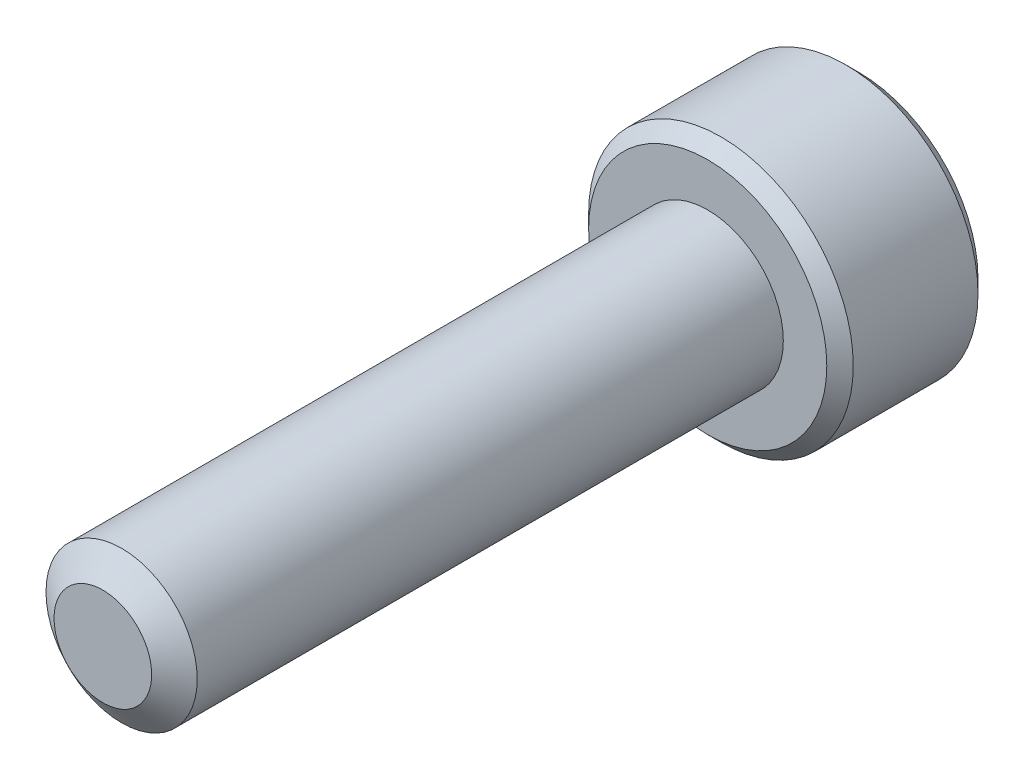
ISO-10303-21;
HEADER;
FILE_DESCRIPTION(('STEP AP214'),'2;1');
FILE_NAME('part.step','',(''),(''),'','','');
FILE_SCHEMA(('AUTOMOTIVE_DESIGN { 1 0 10303 214 1 1 1 1 }'));
ENDSEC;
DATA;
#1=APPLICATION_CONTEXT('core data for automotive mechanical design processes');
#2=APPLICATION_PROTOCOL_DEFINITION('international standard','automotive_design',2000,#1);
#3=PRODUCT_CONTEXT('',#1,'mechanical');
#4=PRODUCT('Part','Part','',(#3));
#5=PRODUCT_RELATED_PRODUCT_CATEGORY('part','',(#4));
#6=PRODUCT_DEFINITION_FORMATION('','',#4);
#7=PRODUCT_DEFINITION_CONTEXT('part definition',#1,'design');
#8=PRODUCT_DEFINITION('design','',#6,#7);
#9=PRODUCT_DEFINITION_SHAPE('','',#8);
#10=(LENGTH_UNIT() NAMED_UNIT(*) SI_UNIT(.MILLI.,.METRE.));
#11=(NAMED_UNIT(*) PLANE_ANGLE_UNIT() SI_UNIT($,.RADIAN.));
#12=(NAMED_UNIT(*) SI_UNIT($,.STERADIAN.) SOLID_ANGLE_UNIT());
#13=UNCERTAINTY_MEASURE_WITH_UNIT(LENGTH_MEASURE(1.E-05),#10,'distance_accuracy_value','');
#14=(GEOMETRIC_REPRESENTATION_CONTEXT(3) GLOBAL_UNCERTAINTY_ASSIGNED_CONTEXT((#13)) GLOBAL_UNIT_ASSIGNED_CONTEXT((#10,
#11,#12)) REPRESENTATION_CONTEXT('',''));
#15=CARTESIAN_POINT('',(0.,0.,0.));
#16=DIRECTION('',(0.,0.,1.));
#17=DIRECTION('',(1.,0.,0.));
#18=AXIS2_PLACEMENT_3D('',#15,#16,#17);
#19=CARTESIAN_POINT('',(-1.5,-0.866025403784439,-17.75));
#20=DIRECTION('',(-1.,0.,0.));
#21=DIRECTION('',(0.,-1.,0.));
#22=AXIS2_PLACEMENT_3D('',#19,#20,#21);
#23=PLANE('',#22);
#24=CARTESIAN_POINT('',(-1.50000000000528,0.866025403801584,-19.999999999995));
#25=CARTESIAN_POINT('',(-1.5000000000019,0.806882875043421,-19.9704563278094));
#26=CARTESIAN_POINT('',(-1.50000000000051,0.746757784428058,-19.9426377148115));
#27=CARTESIAN_POINT('',(-1.49999999999949,0.624133827080468,-19.8916456353052));
#28=CARTESIAN_POINT('',(-1.49999999999986,0.561622210460355,-19.8685031009579));
#29=CARTESIAN_POINT('',(-1.50000000000014,0.434792284451485,-19.8285409180627));
#30=CARTESIAN_POINT('',(-1.50000000000004,0.370480901451347,-19.8116998708606));
#31=CARTESIAN_POINT('',(-1.49999999999996,0.240448320942549,-19.7857723506596));
#32=CARTESIAN_POINT('',(-1.5,0.174732136141869,-19.7766618977947));
#33=CARTESIAN_POINT('',(-1.5,0.0906470714654629,-19.7705759515942));
#34=CARTESIAN_POINT('',(-1.5,0.0725267485204333,-19.7695920445211));
#35=CARTESIAN_POINT('',(-1.5,0.0362717967778035,-19.7682785458525));
#36=CARTESIAN_POINT('',(-1.5,0.0181371811139475,-19.7679485988137));
#37=CARTESIAN_POINT('',(-1.5,-0.0455207597373242,-19.7679506822569));
#38=CARTESIAN_POINT('',(-1.5,-0.0910576795355916,-19.77003428509));
#39=CARTESIAN_POINT('',(-1.5,-0.181776355993392,-19.7782449521126));
#40=CARTESIAN_POINT('',(-1.5,-0.226957842677638,-19.7843748365196));
#41=CARTESIAN_POINT('',(-1.5,-0.361900159540508,-19.8084506931252));
#42=CARTESIAN_POINT('',(-1.5,-0.45067753991022,-19.8320787850761));
#43=CARTESIAN_POINT('',(-1.5,-0.594082384134895,-19.8804157751675));
#44=CARTESIAN_POINT('',(-1.5,-0.649878130235715,-19.9019096020201));
#45=CARTESIAN_POINT('',(-1.5,-0.75935694247947,-19.9484936597313));
#46=CARTESIAN_POINT('',(-1.5,-0.813054664479742,-19.9735491978801));
#47=CARTESIAN_POINT('',(-1.5,-0.866025403800748,-19.9999999999975));
#48=B_SPLINE_CURVE_WITH_KNOTS('',3,(#24,#25,#26,#27,#28,#29,#30,#31,#32,#33,#34,#35,#36,#37,#38,
#39,#40,#41,#42,#43,#44,#45,#46,#47),.UNSPECIFIED.,.F.,.F.,(4,2,2,2,2,2,2,2,2,2,2,4),(0.,
0.198469799187675,0.398212335703268,0.597270292393039,0.795708501538898,0.850141373303903,
0.904544651342541,1.04108618626802,1.17772298989549,1.45212536753346,1.63138869988285,
1.80901239746727),.UNSPECIFIED.);
#49=CARTESIAN_POINT('',(-1.50000000002135,0.866025403796765,-20.000000000014));
#50=VERTEX_POINT('',#49);
#51=CARTESIAN_POINT('',(-1.50000000002135,-0.866025403796765,-20.000000000014));
#52=VERTEX_POINT('',#51);
#53=EDGE_CURVE('E21',#50,#52,#48,.T.);
#54=ORIENTED_EDGE('',*,*,#53,.F.);
#55=DIRECTION('',(0.,0.,1.));
#56=VECTOR('',#55,1.);
#57=CARTESIAN_POINT('',(-1.5,0.866025403784439,-17.75));
#58=LINE('',#57,#56);
#59=CARTESIAN_POINT('',(-1.5,0.866025403784439,-17.75));
#60=VERTEX_POINT('',#59);
#61=EDGE_CURVE('E76',#50,#60,#58,.T.);
#62=ORIENTED_EDGE('',*,*,#61,.T.);
#63=DIRECTION('',(0.,1.,0.));
#64=VECTOR('',#63,1.);
#65=CARTESIAN_POINT('',(-1.5,2.59807621135332,-17.75));
#66=LINE('',#65,#64);
#67=CARTESIAN_POINT('',(-1.5,-0.866025403784439,-17.75));
#68=VERTEX_POINT('',#67);
#69=EDGE_CURVE('E82',#68,#60,#66,.T.);
#70=ORIENTED_EDGE('',*,*,#69,.F.);
#71=DIRECTION('',(0.,0.,1.));
#72=VECTOR('',#71,1.);
#73=CARTESIAN_POINT('',(-1.5,-0.866025403784439,-17.75));
#74=LINE('',#73,#72);
#75=EDGE_CURVE('E79',#68,#52,#74,.F.);
#76=ORIENTED_EDGE('',*,*,#75,.T.);
#77=EDGE_LOOP('',(#54,#62,#70,#76));
#78=FACE_BOUND('',#77,.T.);
#79=ADVANCED_FACE('F17',(#78),#23,.F.);
#80=CARTESIAN_POINT('',(1.5,2.59807621135332,-17.75));
#81=DIRECTION('',(0.,0.,-1.));
#82=DIRECTION('',(-1.,0.,0.));
#83=AXIS2_PLACEMENT_3D('',#80,#81,#82);
#84=PLANE('',#83);
#85=DIRECTION('',(0.866025403784439,-0.5,0.));
#86=VECTOR('',#85,1.);
#87=CARTESIAN_POINT('',(0.,-1.73205080756888,-17.75));
#88=LINE('',#87,#86);
#89=CARTESIAN_POINT('',(0.,-1.73205080756888,-17.75));
#90=VERTEX_POINT('',#89);
#91=EDGE_CURVE('E102',#90,#68,#88,.F.);
#92=ORIENTED_EDGE('',*,*,#91,.T.);
#93=ORIENTED_EDGE('',*,*,#69,.T.);
#94=DIRECTION('',(-0.866025403784439,-0.5,0.));
#95=VECTOR('',#94,1.);
#96=CARTESIAN_POINT('',(-1.5,0.866025403784439,-17.75));
#97=LINE('',#96,#95);
#98=CARTESIAN_POINT('',(0.,1.73205080756888,-17.75));
#99=VERTEX_POINT('',#98);
#100=EDGE_CURVE('E100',#60,#99,#97,.F.);
#101=ORIENTED_EDGE('',*,*,#100,.T.);
#102=DIRECTION('',(-0.866025403784439,0.5,0.));
#103=VECTOR('',#102,1.);
#104=CARTESIAN_POINT('',(0.,1.73205080756888,-17.75));
#105=LINE('',#104,#103);
#106=CARTESIAN_POINT('',(1.5,0.866025403784439,-17.75));
#107=VERTEX_POINT('',#106);
#108=EDGE_CURVE('E259',#99,#107,#105,.F.);
#109=ORIENTED_EDGE('',*,*,#108,.T.);
#110=DIRECTION('',(0.,1.,0.));
#111=VECTOR('',#110,1.);
#112=CARTESIAN_POINT('',(1.5,0.866025403784439,-17.75));
#113=LINE('',#112,#111);
#114=CARTESIAN_POINT('',(1.5,-0.866025403784439,-17.75));
#115=VERTEX_POINT('',#114);
#116=EDGE_CURVE('E265',#107,#115,#113,.F.);
#117=ORIENTED_EDGE('',*,*,#116,.T.);
#118=DIRECTION('',(0.866025403784439,0.5,0.));
#119=VECTOR('',#118,1.);
#120=CARTESIAN_POINT('',(1.5,-0.866025403784439,-17.75));
#121=LINE('',#120,#119);
#122=EDGE_CURVE('E271',#115,#90,#121,.F.);
#123=ORIENTED_EDGE('',*,*,#122,.T.);
#124=EDGE_LOOP('',(#92,#93,#101,#109,#117,#123));
#125=FACE_BOUND('',#124,.T.);
#126=ADVANCED_FACE('F188',(#125),#84,.T.);
#127=CARTESIAN_POINT('',(-1.5,0.866025403784439,-17.75));
#128=DIRECTION('',(-0.5,0.866025403784439,0.));
#129=DIRECTION('',(-0.866025403784439,-0.5,0.));
#130=AXIS2_PLACEMENT_3D('',#127,#128,#129);
#131=PLANE('',#130);
#132=CARTESIAN_POINT('',(-1.50000000001384,0.866025403776446,-19.9999999999973));
#133=CARTESIAN_POINT('',(-1.44844426727188,0.895791119953286,-19.9702628495471));
#134=CARTESIAN_POINT('',(-1.39602652188553,0.926054519362411,-19.9422725002981));
#135=CARTESIAN_POINT('',(-1.28914135981358,0.98776469645703,-19.891023365733));
#136=CARTESIAN_POINT('',(-1.23466378389773,1.01921733957684,-19.8677930861008));
#137=CARTESIAN_POINT('',(-1.12481242370922,1.08264005195252,-19.827999460956));
#138=CARTESIAN_POINT('',(-1.0694666001953,1.11459397805681,-19.8113361226596));
#139=CARTESIAN_POINT('',(-0.957556855434341,1.17920509931949,-19.7856630756138));
#140=CARTESIAN_POINT('',(-0.900996350406153,1.21186032212301,-19.7766342100916));
#141=CARTESIAN_POINT('',(-0.803509072979876,1.26814462798764,-19.7684874106486));
#142=CARTESIAN_POINT('',(-0.762708138291304,1.29170105861327,-19.7672818824402));
#143=CARTESIAN_POINT('',(-0.681178340922777,1.33877230907097,-19.7693161381529));
#144=CARTESIAN_POINT('',(-0.640449496153036,1.36228711856256,-19.7725569040307));
#145=CARTESIAN_POINT('',(-0.55938406541502,1.40909026682113,-19.7832973052436));
#146=CARTESIAN_POINT('',(-0.519047879729584,1.4323783744847,-19.7908009008483));
#147=CARTESIAN_POINT('',(-0.439052551507189,1.47856369876781,-19.8096594735364));
#148=CARTESIAN_POINT('',(-0.399393707169557,1.50146074322189,-19.8210161032335));
#149=CARTESIAN_POINT('',(-0.297850129885444,1.56008695490135,-19.8547185813341));
#150=CARTESIAN_POINT('',(-0.236594120363346,1.59545312848842,-19.8796009834656));
#151=CARTESIAN_POINT('',(-0.146523889004659,1.64745520080933,-19.9216037301785));
#152=CARTESIAN_POINT('',(-0.116842951539739,1.6645914980445,-19.9363606542598));
#153=CARTESIAN_POINT('',(-0.0580266310704294,1.6985491165002,-19.9672215279235));
#154=CARTESIAN_POINT('',(-0.028890996465001,1.71537058298265,-19.9833248365504));
#155=CARTESIAN_POINT('',(1.72314668545733E-11,1.73205080757883,-19.9999999999993));
#156=B_SPLINE_CURVE_WITH_KNOTS('',3,(#132,#133,#134,#135,#136,#137,#138,#139,#140,#141,#142,
#143,#144,#145,#146,#147,#148,#149,#150,#151,#152,#153,#154,#155),.UNSPECIFIED.,.F.,.F.,(4,2,2,
2,2,2,2,2,2,2,2,4),(0.,0.19977441987482,0.400712312207091,0.598459990233483,0.795709985569241,
0.936894690687762,1.07811058123955,1.21945787974225,1.36086588064742,1.58533909972686,
1.69726364724869,1.8091352124411),.UNSPECIFIED.);
#157=CARTESIAN_POINT('',(-3.40810312694829E-11,1.7320508075985,-20.000000000019));
#158=VERTEX_POINT('',#157);
#159=EDGE_CURVE('E97',#50,#158,#156,.T.);
#160=ORIENTED_EDGE('',*,*,#159,.T.);
#161=DIRECTION('',(0.,0.,1.));
#162=VECTOR('',#161,1.);
#163=CARTESIAN_POINT('',(0.,1.73205080756888,-17.75));
#164=LINE('',#163,#162);
#165=EDGE_CURVE('E110',#158,#99,#164,.T.);
#166=ORIENTED_EDGE('',*,*,#165,.T.);
#167=ORIENTED_EDGE('',*,*,#100,.F.);
#168=ORIENTED_EDGE('',*,*,#61,.F.);
#169=EDGE_LOOP('',(#160,#166,#167,#168));
#170=FACE_BOUND('',#169,.T.);
#171=ADVANCED_FACE('F95',(#170),#131,.F.);
#172=CARTESIAN_POINT('',(0.,-1.73205080756888,-17.75));
#173=DIRECTION('',(-0.5,-0.866025403784439,0.));
#174=DIRECTION('',(0.866025403784439,-0.5,0.));
#175=AXIS2_PLACEMENT_3D('',#172,#173,#174);
#176=PLANE('',#175);
#177=CARTESIAN_POINT('',(1.72312254060688E-11,-1.73205080757883,-19.9999999999993));
#178=CARTESIAN_POINT('',(-0.0515557327249302,-1.70228509140187,-19.9702628495488));
#179=CARTESIAN_POINT('',(-0.103973478111488,-1.67202169199263,-19.9422725002996));
#180=CARTESIAN_POINT('',(-0.210858640183868,-1.61031151489776,-19.8910233657342));
#181=CARTESIAN_POINT('',(-0.26533621609994,-1.57885887177782,-19.8677930861018));
#182=CARTESIAN_POINT('',(-0.375187576288911,-1.51543615940187,-19.8279994609566));
#183=CARTESIAN_POINT('',(-0.430533399803071,-1.48348223329745,-19.81133612266));
#184=CARTESIAN_POINT('',(-0.542443144564532,-1.41887111203448,-19.785663075614));
#185=CARTESIAN_POINT('',(-0.599003649592977,-1.3862158892308,-19.7766342100917));
#186=CARTESIAN_POINT('',(-0.696490927019526,-1.32993158336602,-19.7684874106486));
#187=CARTESIAN_POINT('',(-0.73729186170811,-1.30637515274038,-19.7672818824402));
#188=CARTESIAN_POINT('',(-0.818821659076663,-1.25930390228267,-19.7693161381528));
#189=CARTESIAN_POINT('',(-0.859550503846418,-1.23578909279107,-19.7725569040307));
#190=CARTESIAN_POINT('',(-0.940615934584459,-1.18898594453249,-19.7832973052435));
#191=CARTESIAN_POINT('',(-0.980952120269905,-1.16569783686891,-19.7908009008482));
#192=CARTESIAN_POINT('',(-1.06094744849232,-1.11951251258579,-19.8096594735362));
#193=CARTESIAN_POINT('',(-1.10060629282997,-1.0966154681317,-19.8210161032333));
#194=CARTESIAN_POINT('',(-1.20214987011356,-1.03798925645254,-19.8547185813338));
#195=CARTESIAN_POINT('',(-1.26340587963515,-1.00262308286577,-19.879600983465));
#196=CARTESIAN_POINT('',(-1.35347611099311,-0.950621010545279,-19.9216037301774));
#197=CARTESIAN_POINT('',(-1.38315704845779,-0.933484713310244,-19.9363606542586));
#198=CARTESIAN_POINT('',(-1.44197336892664,-0.899527094854813,-19.967221527922));
#199=CARTESIAN_POINT('',(-1.47110900353184,-0.88270562837249,-19.9833248365487));
#200=CARTESIAN_POINT('',(-1.50000000001385,-0.866025403776446,-19.9999999999973));
#201=B_SPLINE_CURVE_WITH_KNOTS('',3,(#177,#178,#179,#180,#181,#182,#183,#184,#185,#186,#187,
#188,#189,#190,#191,#192,#193,#194,#195,#196,#197,#198,#199,#200),.UNSPECIFIED.,.F.,.F.,(4,2,2,
2,2,2,2,2,2,2,2,4),(0.,0.199774419875724,0.400712312208921,0.598459990236235,0.795709985572903,
0.936894690691468,1.0781105812433,1.21945787974603,1.36086588065123,1.58533909972875,
1.69726364724963,1.80913521244109),.UNSPECIFIED.);
#202=CARTESIAN_POINT('',(0.,-1.73205080759353,-20.000000000014));
#203=VERTEX_POINT('',#202);
#204=EDGE_CURVE('E109',#203,#52,#201,.T.);
#205=ORIENTED_EDGE('',*,*,#204,.T.);
#206=ORIENTED_EDGE('',*,*,#75,.F.);
#207=ORIENTED_EDGE('',*,*,#91,.F.);
#208=DIRECTION('',(0.,0.,1.));
#209=VECTOR('',#208,1.);
#210=CARTESIAN_POINT('',(0.,-1.73205080756888,-17.75));
#211=LINE('',#210,#209);
#212=EDGE_CURVE('E268',#90,#203,#211,.F.);
#213=ORIENTED_EDGE('',*,*,#212,.T.);
#214=EDGE_LOOP('',(#205,#206,#207,#213));
#215=FACE_BOUND('',#214,.T.);
#216=ADVANCED_FACE('F179',(#215),#176,.F.);
#217=CARTESIAN_POINT('',(1.5,-0.866025403784439,-17.75));
#218=DIRECTION('',(0.5,-0.866025403784439,0.));
#219=DIRECTION('',(0.866025403784439,0.5,0.));
#220=AXIS2_PLACEMENT_3D('',#217,#218,#219);
#221=PLANE('',#220);
#222=CARTESIAN_POINT('',(1.50000000001723,-0.86602540377449,-19.9999999999993));
#223=CARTESIAN_POINT('',(1.44844426727507,-0.895791119951447,-19.9702628495488));
#224=CARTESIAN_POINT('',(1.39602652188851,-0.926054519360691,-19.9422725002996));
#225=CARTESIAN_POINT('',(1.28914135981612,-0.98776469645556,-19.8910233657341));
#226=CARTESIAN_POINT('',(1.23466378390004,-1.0192173395755,-19.8677930861018));
#227=CARTESIAN_POINT('',(1.12481242371107,-1.08264005195145,-19.8279994609566));
#228=CARTESIAN_POINT('',(1.06946660019692,-1.11459397805587,-19.81133612266));
#229=CARTESIAN_POINT('',(0.957556855435461,-1.17920509931884,-19.785663075614));
#230=CARTESIAN_POINT('',(0.90099635040702,-1.21186032212251,-19.7766342100917));
#231=CARTESIAN_POINT('',(0.803509072980475,-1.26814462798729,-19.7684874106486));
#232=CARTESIAN_POINT('',(0.762708138291893,-1.29170105861293,-19.7672818824402));
#233=CARTESIAN_POINT('',(0.681178340923342,-1.33877230907064,-19.7693161381528));
#234=CARTESIAN_POINT('',(0.640449496153588,-1.36228711856224,-19.7725569040307));
#235=CARTESIAN_POINT('',(0.559384065415547,-1.40909026682082,-19.7832973052435));
#236=CARTESIAN_POINT('',(0.519047879730099,-1.4323783744844,-19.7908009008482));
#237=CARTESIAN_POINT('',(0.439052551507678,-1.47856369876753,-19.8096594735362));
#238=CARTESIAN_POINT('',(0.399393707170034,-1.50146074322162,-19.8210161032333));
#239=CARTESIAN_POINT('',(0.297850129885826,-1.56008695490113,-19.854718581334));
#240=CARTESIAN_POINT('',(0.236594120363648,-1.59545312848824,-19.8796009834655));
#241=CARTESIAN_POINT('',(0.146523889004846,-1.64745520080922,-19.9216037301784));
#242=CARTESIAN_POINT('',(0.116842951539888,-1.66459149804441,-19.9363606542597));
#243=CARTESIAN_POINT('',(0.0580266310705035,-1.69854911650015,-19.9672215279235));
#244=CARTESIAN_POINT('',(0.0288909964650379,-1.71537058298263,-19.9833248365504));
#245=CARTESIAN_POINT('',(-1.72314939480501E-11,-1.73205080757883,-19.9999999999993));
#246=B_SPLINE_CURVE_WITH_KNOTS('',3,(#222,#223,#224,#225,#226,#227,#228,#229,#230,#231,#232,
#233,#234,#235,#236,#237,#238,#239,#240,#241,#242,#243,#244,#245),.UNSPECIFIED.,.F.,.F.,(4,2,2,
2,2,2,2,2,2,2,2,4),(0.,0.199774419875735,0.400712312208944,0.598459990236248,0.795709985572904,
0.936894690691465,1.07811058124329,1.21945787974602,1.36086588065123,1.58533909973094,
1.69726364725292,1.80913521244546),.UNSPECIFIED.);
#247=CARTESIAN_POINT('',(1.50000000002135,-0.866025403796764,-20.000000000014));
#248=VERTEX_POINT('',#247);
#249=EDGE_CURVE('E161',#248,#203,#246,.T.);
#250=ORIENTED_EDGE('',*,*,#249,.T.);
#251=ORIENTED_EDGE('',*,*,#212,.F.);
#252=ORIENTED_EDGE('',*,*,#122,.F.);
#253=DIRECTION('',(0.,0.,-1.));
#254=VECTOR('',#253,1.);
#255=CARTESIAN_POINT('',(1.5,-0.866025403784439,-17.75));
#256=LINE('',#255,#254);
#257=EDGE_CURVE('E262',#115,#248,#256,.T.);
#258=ORIENTED_EDGE('',*,*,#257,.T.);
#259=EDGE_LOOP('',(#250,#251,#252,#258));
#260=FACE_BOUND('',#259,.T.);
#261=ADVANCED_FACE('F175',(#260),#221,.F.);
#262=CARTESIAN_POINT('',(1.5,0.866025403784439,-17.75));
#263=DIRECTION('',(1.,0.,0.));
#264=DIRECTION('',(0.,0.,-1.));
#265=AXIS2_PLACEMENT_3D('',#262,#263,#264);
#266=PLANE('',#265);
#267=CARTESIAN_POINT('',(1.5,0.866025403804336,-19.9999999999993));
#268=CARTESIAN_POINT('',(1.5,0.806493971450421,-19.9702628495488));
#269=CARTESIAN_POINT('',(1.5,0.745967172631933,-19.9422725002996));
#270=CARTESIAN_POINT('',(1.5,0.622546818442195,-19.8910233657341));
#271=CARTESIAN_POINT('',(1.5,0.559641532202306,-19.8677930861018));
#272=CARTESIAN_POINT('',(1.5,0.432796107450408,-19.8279994609566));
#273=CARTESIAN_POINT('',(1.5,0.368888255241567,-19.81133612266));
#274=CARTESIAN_POINT('',(1.5,0.239666012715631,-19.785663075614));
#275=CARTESIAN_POINT('',(1.5,0.174355567108288,-19.7766342100917));
#276=CARTESIAN_POINT('',(1.5,0.0617869553787295,-19.7684874106486));
#277=CARTESIAN_POINT('',(1.5,0.0146740941274464,-19.7672818824402));
#278=CARTESIAN_POINT('',(1.5,-0.0794684067879708,-19.7693161381528));
#279=CARTESIAN_POINT('',(1.5,-0.12649802577117,-19.7725569040307));
#280=CARTESIAN_POINT('',(1.5,-0.220104322288332,-19.7832973052435));
#281=CARTESIAN_POINT('',(1.5,-0.266680537615484,-19.7908009008482));
#282=CARTESIAN_POINT('',(1.5,-0.359051186181738,-19.8096594735362));
#283=CARTESIAN_POINT('',(1.5,-0.404845275089915,-19.8210161032333));
#284=CARTESIAN_POINT('',(1.5,-0.522097698448944,-19.854718581334));
#285=CARTESIAN_POINT('',(1.5,-0.592830045623168,-19.8796009834655));
#286=CARTESIAN_POINT('',(1.5,-0.696834190265121,-19.9216037301784));
#287=CARTESIAN_POINT('',(1.5,-0.73110678473551,-19.9363606542597));
#288=CARTESIAN_POINT('',(1.5,-0.799022021646996,-19.9672215279235));
#289=CARTESIAN_POINT('',(1.5,-0.832664954611947,-19.9833248365504));
#290=CARTESIAN_POINT('',(1.5,-0.866025403804335,-19.9999999999993));
#291=B_SPLINE_CURVE_WITH_KNOTS('',3,(#267,#268,#269,#270,#271,#272,#273,#274,#275,#276,#277,
#278,#279,#280,#281,#282,#283,#284,#285,#286,#287,#288,#289,#290),.UNSPECIFIED.,.F.,.F.,(4,2,2,
2,2,2,2,2,2,2,2,4),(0.,0.199774419875736,0.400712312208945,0.598459990236247,0.795709985572903,
0.936894690691464,1.07811058124329,1.21945787974602,1.36086588065123,1.58533909973094,
1.69726364725292,1.80913521244546),.UNSPECIFIED.);
#292=CARTESIAN_POINT('',(1.50000000002135,0.866025403796765,-20.000000000014));
#293=VERTEX_POINT('',#292);
#294=EDGE_CURVE('E123',#293,#248,#291,.T.);
#295=ORIENTED_EDGE('',*,*,#294,.T.);
#296=ORIENTED_EDGE('',*,*,#257,.F.);
#297=ORIENTED_EDGE('',*,*,#116,.F.);
#298=DIRECTION('',(0.,0.,1.));
#299=VECTOR('',#298,1.);
#300=CARTESIAN_POINT('',(1.5,0.866025403784439,-17.75));
#301=LINE('',#300,#299);
#302=EDGE_CURVE('E46',#107,#293,#301,.F.);
#303=ORIENTED_EDGE('',*,*,#302,.T.);
#304=EDGE_LOOP('',(#295,#296,#297,#303));
#305=FACE_BOUND('',#304,.T.);
#306=ADVANCED_FACE('F178',(#305),#266,.F.);
#307=CARTESIAN_POINT('',(0.,1.73205080756888,-17.75));
#308=DIRECTION('',(0.5,0.866025403784439,0.));
#309=DIRECTION('',(-0.866025403784439,0.5,0.));
#310=AXIS2_PLACEMENT_3D('',#307,#308,#309);
#311=PLANE('',#310);
#312=CARTESIAN_POINT('',(-1.72305140332419E-11,1.73205080757883,-19.9999999999993));
#313=CARTESIAN_POINT('',(0.0515557327249341,1.70228509140187,-19.9702628495488));
#314=CARTESIAN_POINT('',(0.103973478111494,1.67202169199262,-19.9422725002996));
#315=CARTESIAN_POINT('',(0.21085864018388,1.61031151489776,-19.8910233657341));
#316=CARTESIAN_POINT('',(0.265336216099955,1.57885887177781,-19.8677930861018));
#317=CARTESIAN_POINT('',(0.375187576288925,1.51543615940186,-19.8279994609566));
#318=CARTESIAN_POINT('',(0.430533399803083,1.48348223329744,-19.81133612266));
#319=CARTESIAN_POINT('',(0.542443144564537,1.41887111203448,-19.785663075614));
#320=CARTESIAN_POINT('',(0.599003649592977,1.3862158892308,-19.7766342100917));
#321=CARTESIAN_POINT('',(0.696490927019521,1.32993158336603,-19.7684874106486));
#322=CARTESIAN_POINT('',(0.737291861708103,1.30637515274038,-19.7672818824402));
#323=CARTESIAN_POINT('',(0.818821659076654,1.25930390228268,-19.7693161381528));
#324=CARTESIAN_POINT('',(0.859550503846408,1.23578909279108,-19.7725569040307));
#325=CARTESIAN_POINT('',(0.940615934584449,1.18898594453249,-19.7832973052435));
#326=CARTESIAN_POINT('',(0.980952120269897,1.16569783686892,-19.7908009008482));
#327=CARTESIAN_POINT('',(1.06094744849232,1.11951251258579,-19.8096594735362));
#328=CARTESIAN_POINT('',(1.10060629282996,1.0966154681317,-19.8210161032333));
#329=CARTESIAN_POINT('',(1.20214987011417,1.03798925645219,-19.854718581334));
#330=CARTESIAN_POINT('',(1.26340587963635,1.00262308286508,-19.8796009834655));
#331=CARTESIAN_POINT('',(1.35347611099515,0.9506210105441,-19.9216037301784));
#332=CARTESIAN_POINT('',(1.38315704846011,0.933484713308906,-19.9363606542597));
#333=CARTESIAN_POINT('',(1.4419733689295,0.899527094853162,-19.9672215279235));
#334=CARTESIAN_POINT('',(1.47110900353496,0.882705628370685,-19.9833248365504));
#335=CARTESIAN_POINT('',(1.50000000001723,0.866025403774491,-19.9999999999993));
#336=B_SPLINE_CURVE_WITH_KNOTS('',3,(#312,#313,#314,#315,#316,#317,#318,#319,#320,#321,#322,
#323,#324,#325,#326,#327,#328,#329,#330,#331,#332,#333,#334,#335),.UNSPECIFIED.,.F.,.F.,(4,2,2,
2,2,2,2,2,2,2,2,4),(0.,0.199774419875735,0.400712312208942,0.598459990236243,0.795709985572898,
0.936894690691458,1.07811058124329,1.21945787974602,1.36086588065123,1.58533909973093,
1.69726364725291,1.80913521244546),.UNSPECIFIED.);
#337=EDGE_CURVE('E118',#158,#293,#336,.T.);
#338=ORIENTED_EDGE('',*,*,#337,.T.);
#339=ORIENTED_EDGE('',*,*,#302,.F.);
#340=ORIENTED_EDGE('',*,*,#108,.F.);
#341=ORIENTED_EDGE('',*,*,#165,.F.);
#342=EDGE_LOOP('',(#338,#339,#340,#341));
#343=FACE_BOUND('',#342,.T.);
#344=ADVANCED_FACE('F140',(#343),#311,.F.);
#345=CARTESIAN_POINT('',(0.,0.,-20.0000000000387));
#346=DIRECTION('',(0.,0.,-1.));
#347=DIRECTION('',(-1.,0.,0.));
#348=AXIS2_PLACEMENT_3D('',#345,#346,#347);
#349=CONICAL_SURFACE('',#348,1.73205080761818,0.785398163397448);
#350=ORIENTED_EDGE('',*,*,#159,.F.);
#351=CARTESIAN_POINT('',(0.,0.,-20.0000000000387));
#352=DIRECTION('',(0.,0.,-1.));
#353=DIRECTION('',(-1.,0.,0.));
#354=AXIS2_PLACEMENT_3D('',#351,#352,#353);
#355=CIRCLE('',#354,1.73205080761818);
#356=EDGE_CURVE('E91',#158,#50,#355,.F.);
#357=ORIENTED_EDGE('',*,*,#356,.F.);
#358=EDGE_LOOP('',(#350,#357));
#359=FACE_BOUND('',#358,.T.);
#360=ADVANCED_FACE('F106',(#359),#349,.F.);
#361=CARTESIAN_POINT('',(0.,0.,-20.0000000000387));
#362=DIRECTION('',(0.,0.,-1.));
#363=DIRECTION('',(-1.,0.,0.));
#364=AXIS2_PLACEMENT_3D('',#361,#362,#363);
#365=CONICAL_SURFACE('',#364,1.73205080761818,0.785398163397448);
#366=ORIENTED_EDGE('',*,*,#53,.T.);
#367=CARTESIAN_POINT('',(0.,0.,-20.0000000000387));
#368=DIRECTION('',(0.,0.,-1.));
#369=DIRECTION('',(-1.,0.,0.));
#370=AXIS2_PLACEMENT_3D('',#367,#368,#369);
#371=CIRCLE('',#370,1.73205080761818);
#372=EDGE_CURVE('E84',#50,#52,#371,.F.);
#373=ORIENTED_EDGE('',*,*,#372,.F.);
#374=EDGE_LOOP('',(#366,#373));
#375=FACE_BOUND('',#374,.T.);
#376=ADVANCED_FACE('F85',(#375),#365,.F.);
#377=CARTESIAN_POINT('',(0.,0.,-20.0000000000387));
#378=DIRECTION('',(0.,0.,-1.));
#379=DIRECTION('',(-1.,0.,0.));
#380=AXIS2_PLACEMENT_3D('',#377,#378,#379);
#381=CONICAL_SURFACE('',#380,1.73205080761818,0.785398163397448);
#382=ORIENTED_EDGE('',*,*,#204,.F.);
#383=CARTESIAN_POINT('',(0.,0.,-20.0000000000387));
#384=DIRECTION('',(0.,0.,-1.));
#385=DIRECTION('',(-1.,0.,0.));
#386=AXIS2_PLACEMENT_3D('',#383,#384,#385);
#387=CIRCLE('',#386,1.73205080761818);
#388=EDGE_CURVE('E90',#52,#203,#387,.F.);
#389=ORIENTED_EDGE('',*,*,#388,.F.);
#390=EDGE_LOOP('',(#382,#389));
#391=FACE_BOUND('',#390,.T.);
#392=ADVANCED_FACE('F158',(#391),#381,.F.);
#393=CARTESIAN_POINT('',(0.,0.,-20.0000000000387));
#394=DIRECTION('',(0.,0.,-1.));
#395=DIRECTION('',(-1.,0.,0.));
#396=AXIS2_PLACEMENT_3D('',#393,#394,#395);
#397=CONICAL_SURFACE('',#396,1.73205080761818,0.785398163397448);
#398=ORIENTED_EDGE('',*,*,#249,.F.);
#399=CARTESIAN_POINT('',(0.,0.,-20.0000000000387));
#400=DIRECTION('',(0.,0.,-1.));
#401=DIRECTION('',(-1.,0.,0.));
#402=AXIS2_PLACEMENT_3D('',#399,#400,#401);
#403=CIRCLE('',#402,1.73205080761818);
#404=EDGE_CURVE('E322',#203,#248,#403,.F.);
#405=ORIENTED_EDGE('',*,*,#404,.F.);
#406=EDGE_LOOP('',(#398,#405));
#407=FACE_BOUND('',#406,.T.);
#408=ADVANCED_FACE('F153',(#407),#397,.F.);
#409=CARTESIAN_POINT('',(0.,0.,-20.0000000000387));
#410=DIRECTION('',(0.,0.,-1.));
#411=DIRECTION('',(-1.,0.,0.));
#412=AXIS2_PLACEMENT_3D('',#409,#410,#411);
#413=CONICAL_SURFACE('',#412,1.73205080761818,0.785398163397448);
#414=ORIENTED_EDGE('',*,*,#294,.F.);
#415=CARTESIAN_POINT('',(0.,0.,-20.0000000000387));
#416=DIRECTION('',(0.,0.,-1.));
#417=DIRECTION('',(-1.,0.,0.));
#418=AXIS2_PLACEMENT_3D('',#415,#416,#417);
#419=CIRCLE('',#418,1.73205080761818);
#420=EDGE_CURVE('E319',#248,#293,#419,.F.);
#421=ORIENTED_EDGE('',*,*,#420,.F.);
#422=EDGE_LOOP('',(#414,#421));
#423=FACE_BOUND('',#422,.T.);
#424=ADVANCED_FACE('F147',(#423),#413,.F.);
#425=CARTESIAN_POINT('',(0.,0.,-20.0000000000387));
#426=DIRECTION('',(0.,0.,-1.));
#427=DIRECTION('',(-1.,0.,0.));
#428=AXIS2_PLACEMENT_3D('',#425,#426,#427);
#429=CONICAL_SURFACE('',#428,1.73205080761818,0.785398163397448);
#430=ORIENTED_EDGE('',*,*,#337,.F.);
#431=CARTESIAN_POINT('',(0.,0.,-20.0000000000387));
#432=DIRECTION('',(0.,0.,-1.));
#433=DIRECTION('',(-1.,0.,0.));
#434=AXIS2_PLACEMENT_3D('',#431,#432,#433);
#435=CIRCLE('',#434,1.73205080761818);
#436=EDGE_CURVE('E116',#293,#158,#435,.F.);
#437=ORIENTED_EDGE('',*,*,#436,.F.);
#438=EDGE_LOOP('',(#430,#437));
#439=FACE_BOUND('',#438,.T.);
#440=ADVANCED_FACE('F143',(#439),#429,.F.);
#441=CARTESIAN_POINT('',(0.,0.,-20.));
#442=DIRECTION('',(0.,0.,-1.));
#443=DIRECTION('',(-1.,0.,0.));
#444=AXIS2_PLACEMENT_3D('',#441,#442,#443);
#445=PLANE('',#444);
#446=ORIENTED_EDGE('',*,*,#420,.T.);
#447=ORIENTED_EDGE('',*,*,#436,.T.);
#448=ORIENTED_EDGE('',*,*,#356,.T.);
#449=ORIENTED_EDGE('',*,*,#372,.T.);
#450=ORIENTED_EDGE('',*,*,#388,.T.);
#451=ORIENTED_EDGE('',*,*,#404,.T.);
#452=EDGE_LOOP('',(#446,#447,#448,#449,#450,#451));
#453=FACE_BOUND('',#452,.T.);
#454=CARTESIAN_POINT('',(0.,0.,-19.9999999999818));
#455=DIRECTION('',(0.,0.,1.));
#456=DIRECTION('',(1.,0.,0.));
#457=AXIS2_PLACEMENT_3D('',#454,#455,#456);
#458=CIRCLE('',#457,3.15000000000509);
#459=CARTESIAN_POINT('',(3.15000000000509,0.,-19.9999999999818));
#460=VERTEX_POINT('',#459);
#461=EDGE_CURVE('E238',#460,#460,#458,.T.);
#462=ORIENTED_EDGE('',*,*,#461,.F.);
#463=EDGE_LOOP('',(#462));
#464=FACE_BOUND('',#463,.T.);
#465=ADVANCED_FACE('F113',(#453,#464),#445,.T.);
#466=CARTESIAN_POINT('',(0.,0.,-19.6500000000128));
#467=DIRECTION('',(0.,0.,1.));
#468=DIRECTION('',(1.,0.,0.));
#469=AXIS2_PLACEMENT_3D('',#466,#467,#468);
#470=CONICAL_SURFACE('',#469,3.50000000003092,0.785398163478653);
#471=ORIENTED_EDGE('',*,*,#461,.T.);
#472=EDGE_LOOP('',(#471));
#473=FACE_BOUND('',#472,.T.);
#474=CARTESIAN_POINT('',(0.,0.,-19.65));
#475=DIRECTION('',(0.,0.,1.));
#476=DIRECTION('',(1.,0.,0.));
#477=AXIS2_PLACEMENT_3D('',#474,#475,#476);
#478=CIRCLE('',#477,3.5);
#479=CARTESIAN_POINT('',(3.5,0.,-19.65));
#480=VERTEX_POINT('',#479);
#481=EDGE_CURVE('E241',#480,#480,#478,.T.);
#482=ORIENTED_EDGE('',*,*,#481,.F.);
#483=EDGE_LOOP('',(#482));
#484=FACE_BOUND('',#483,.T.);
#485=ADVANCED_FACE('F228',(#473,#484),#470,.T.);
#486=CARTESIAN_POINT('',(0.,0.,-20.));
#487=DIRECTION('',(0.,0.,1.));
#488=DIRECTION('',(1.,0.,0.));
#489=AXIS2_PLACEMENT_3D('',#486,#487,#488);
#490=CYLINDRICAL_SURFACE('',#489,3.5);
#491=ORIENTED_EDGE('',*,*,#481,.T.);
#492=EDGE_LOOP('',(#491));
#493=FACE_BOUND('',#492,.T.);
#494=CARTESIAN_POINT('',(0.,0.,-16.3499999999885));
#495=DIRECTION('',(0.,0.,-1.));
#496=DIRECTION('',(-1.,0.,0.));
#497=AXIS2_PLACEMENT_3D('',#494,#495,#496);
#498=CIRCLE('',#497,3.50000000003092);
#499=CARTESIAN_POINT('',(-3.50000000003092,0.,-16.3499999999885));
#500=VERTEX_POINT('',#499);
#501=EDGE_CURVE('E243',#500,#500,#498,.F.);
#502=ORIENTED_EDGE('',*,*,#501,.F.);
#503=EDGE_LOOP('',(#502));
#504=FACE_BOUND('',#503,.T.);
#505=ADVANCED_FACE('F225',(#493,#504),#490,.T.);
#506=CARTESIAN_POINT('',(0.,0.,-16.3499999999885));
#507=DIRECTION('',(0.,0.,-1.));
#508=DIRECTION('',(-1.,0.,0.));
#509=AXIS2_PLACEMENT_3D('',#506,#507,#508);
#510=CONICAL_SURFACE('',#509,3.50000000003092,0.785398163478653);
#511=CARTESIAN_POINT('',(0.,0.,-16.0000000000196));
#512=DIRECTION('',(0.,0.,-1.));
#513=DIRECTION('',(-1.,0.,0.));
#514=AXIS2_PLACEMENT_3D('',#511,#512,#513);
#515=CIRCLE('',#514,3.15000000000509);
#516=CARTESIAN_POINT('',(-3.15000000000509,0.,-16.0000000000196));
#517=VERTEX_POINT('',#516);
#518=EDGE_CURVE('E249',#517,#517,#515,.T.);
#519=ORIENTED_EDGE('',*,*,#518,.T.);
#520=EDGE_LOOP('',(#519));
#521=FACE_BOUND('',#520,.T.);
#522=ORIENTED_EDGE('',*,*,#501,.T.);
#523=EDGE_LOOP('',(#522));
#524=FACE_BOUND('',#523,.T.);
#525=ADVANCED_FACE('F221',(#521,#524),#510,.T.);
#526=CARTESIAN_POINT('',(0.,0.,0.));
#527=DIRECTION('',(0.,0.,1.));
#528=DIRECTION('',(1.,0.,0.));
#529=AXIS2_PLACEMENT_3D('',#526,#527,#528);
#530=PLANE('',#529);
#531=CARTESIAN_POINT('',(0.,0.,1.70412729066927E-11));
#532=DIRECTION('',(0.,0.,-1.));
#533=DIRECTION('',(-1.,0.,0.));
#534=AXIS2_PLACEMENT_3D('',#531,#532,#533);
#535=CIRCLE('',#534,1.29133666297321);
#536=CARTESIAN_POINT('',(-1.29133666297321,0.,1.70412729066927E-11));
#537=VERTEX_POINT('',#536);
#538=EDGE_CURVE('E311',#537,#537,#535,.T.);
#539=ORIENTED_EDGE('',*,*,#538,.F.);
#540=EDGE_LOOP('',(#539));
#541=FACE_BOUND('',#540,.T.);
#542=ADVANCED_FACE('F217',(#541),#530,.T.);
#543=CARTESIAN_POINT('',(0.,0.,-16.));
#544=DIRECTION('',(0.,0.,-1.));
#545=DIRECTION('',(-1.,0.,0.));
#546=AXIS2_PLACEMENT_3D('',#543,#544,#545);
#547=PLANE('',#546);
#548=CARTESIAN_POINT('',(0.,0.,-16.));
#549=DIRECTION('',(0.,0.,1.));
#550=DIRECTION('',(1.,0.,0.));
#551=AXIS2_PLACEMENT_3D('',#548,#549,#550);
#552=CIRCLE('',#551,2.);
#553=CARTESIAN_POINT('',(2.,0.,-16.));
#554=VERTEX_POINT('',#553);
#555=EDGE_CURVE('E33',#554,#554,#552,.T.);
#556=ORIENTED_EDGE('',*,*,#555,.F.);
#557=EDGE_LOOP('',(#556));
#558=FACE_BOUND('',#557,.T.);
#559=ORIENTED_EDGE('',*,*,#518,.F.);
#560=EDGE_LOOP('',(#559));
#561=FACE_BOUND('',#560,.T.);
#562=ADVANCED_FACE('F210',(#558,#561),#547,.F.);
#563=CARTESIAN_POINT('',(0.,0.,-0.496211410620617));
#564=DIRECTION('',(0.,0.,-1.));
#565=DIRECTION('',(-1.,0.,0.));
#566=AXIS2_PLACEMENT_3D('',#563,#564,#565);
#567=CONICAL_SURFACE('',#566,1.99999999989586,0.959931088529116);
#568=CARTESIAN_POINT('',(0.,0.,-0.496211410611024));
#569=DIRECTION('',(0.,0.,1.));
#570=DIRECTION('',(1.,0.,0.));
#571=AXIS2_PLACEMENT_3D('',#568,#569,#570);
#572=CIRCLE('',#571,2.);
#573=CARTESIAN_POINT('',(2.,0.,-0.496211410611024));
#574=VERTEX_POINT('',#573);
#575=EDGE_CURVE('E11',#574,#574,#572,.F.);
#576=ORIENTED_EDGE('',*,*,#575,.F.);
#577=EDGE_LOOP('',(#576));
#578=FACE_BOUND('',#577,.T.);
#579=ORIENTED_EDGE('',*,*,#538,.T.);
#580=EDGE_LOOP('',(#579));
#581=FACE_BOUND('',#580,.T.);
#582=ADVANCED_FACE('F204',(#578,#581),#567,.T.);
#583=CARTESIAN_POINT('',(0.,0.,-16.));
#584=DIRECTION('',(0.,0.,1.));
#585=DIRECTION('',(1.,0.,0.));
#586=AXIS2_PLACEMENT_3D('',#583,#584,#585);
#587=CYLINDRICAL_SURFACE('',#586,2.);
#588=ORIENTED_EDGE('',*,*,#575,.T.);
#589=EDGE_LOOP('',(#588));
#590=FACE_BOUND('',#589,.T.);
#591=ORIENTED_EDGE('',*,*,#555,.T.);
#592=EDGE_LOOP('',(#591));
#593=FACE_BOUND('',#592,.T.);
#594=ADVANCED_FACE('F202',(#590,#593),#587,.T.);
#595=CLOSED_SHELL('',(#79,#126,#171,#216,#261,#306,#344,#360,#376,#392,#408,#424,#440,#465,#485,
#505,#525,#542,#562,#582,#594));
#596=MANIFOLD_SOLID_BREP('B1',#595);
#597=ADVANCED_BREP_SHAPE_REPRESENTATION('',(#18,#596),#14);
#598=SHAPE_DEFINITION_REPRESENTATION(#9,#597);
ENDSEC;
END-ISO-10303-21;
